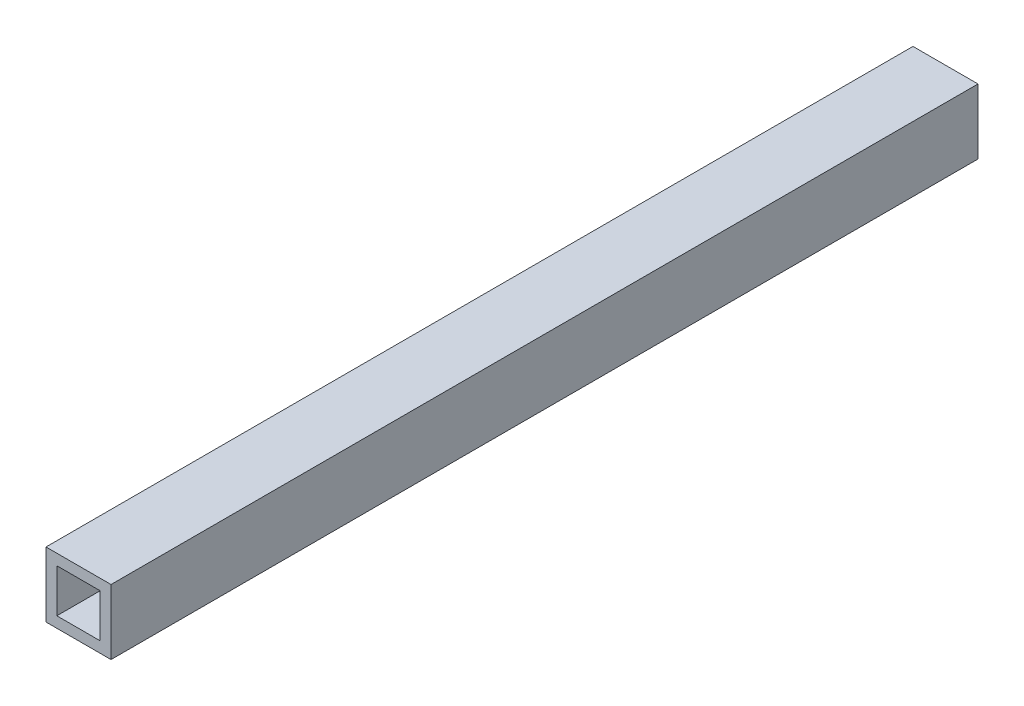
ISO-10303-21;
HEADER;
FILE_DESCRIPTION(('STEP AP214'),'2;1');
FILE_NAME('part.step','',(''),(''),'','','');
FILE_SCHEMA(('AUTOMOTIVE_DESIGN { 1 0 10303 214 1 1 1 1 }'));
ENDSEC;
DATA;
#1=APPLICATION_CONTEXT('core data for automotive mechanical design processes');
#2=APPLICATION_PROTOCOL_DEFINITION('international standard','automotive_design',2000,#1);
#3=PRODUCT_CONTEXT('',#1,'mechanical');
#4=PRODUCT('Part','Part','',(#3));
#5=PRODUCT_RELATED_PRODUCT_CATEGORY('part','',(#4));
#6=PRODUCT_DEFINITION_FORMATION('','',#4);
#7=PRODUCT_DEFINITION_CONTEXT('part definition',#1,'design');
#8=PRODUCT_DEFINITION('design','',#6,#7);
#9=PRODUCT_DEFINITION_SHAPE('','',#8);
#10=(LENGTH_UNIT() NAMED_UNIT(*) SI_UNIT(.MILLI.,.METRE.));
#11=(NAMED_UNIT(*) PLANE_ANGLE_UNIT() SI_UNIT($,.RADIAN.));
#12=(NAMED_UNIT(*) SI_UNIT($,.STERADIAN.) SOLID_ANGLE_UNIT());
#13=UNCERTAINTY_MEASURE_WITH_UNIT(LENGTH_MEASURE(1.E-05),#10,'distance_accuracy_value','');
#14=(GEOMETRIC_REPRESENTATION_CONTEXT(3) GLOBAL_UNCERTAINTY_ASSIGNED_CONTEXT((#13)) GLOBAL_UNIT_ASSIGNED_CONTEXT((#10,
#11,#12)) REPRESENTATION_CONTEXT('',''));
#15=CARTESIAN_POINT('',(0.,0.,0.));
#16=DIRECTION('',(0.,0.,1.));
#17=DIRECTION('',(1.,0.,0.));
#18=AXIS2_PLACEMENT_3D('',#15,#16,#17);
#19=CARTESIAN_POINT('',(0.,0.,400.));
#20=DIRECTION('',(0.,0.,1.));
#21=DIRECTION('',(1.,0.,0.));
#22=AXIS2_PLACEMENT_3D('',#19,#20,#21);
#23=PLANE('',#22);
#24=DIRECTION('',(0.,1.,0.));
#25=VECTOR('',#24,1.);
#26=CARTESIAN_POINT('',(15.,15.,400.));
#27=LINE('',#26,#25);
#28=CARTESIAN_POINT('',(15.,-15.,400.));
#29=VERTEX_POINT('',#28);
#30=CARTESIAN_POINT('',(15.,15.,400.));
#31=VERTEX_POINT('',#30);
#32=EDGE_CURVE('E136',#29,#31,#27,.T.);
#33=ORIENTED_EDGE('',*,*,#32,.T.);
#34=DIRECTION('',(-1.,0.,0.));
#35=VECTOR('',#34,1.);
#36=CARTESIAN_POINT('',(-15.,15.,400.));
#37=LINE('',#36,#35);
#38=CARTESIAN_POINT('',(-15.,15.,400.));
#39=VERTEX_POINT('',#38);
#40=EDGE_CURVE('E139',#31,#39,#37,.T.);
#41=ORIENTED_EDGE('',*,*,#40,.T.);
#42=DIRECTION('',(0.,-1.,0.));
#43=VECTOR('',#42,1.);
#44=CARTESIAN_POINT('',(-15.,15.,400.));
#45=LINE('',#44,#43);
#46=CARTESIAN_POINT('',(-15.,-15.,400.));
#47=VERTEX_POINT('',#46);
#48=EDGE_CURVE('E142',#39,#47,#45,.T.);
#49=ORIENTED_EDGE('',*,*,#48,.T.);
#50=DIRECTION('',(1.,0.,0.));
#51=VECTOR('',#50,1.);
#52=CARTESIAN_POINT('',(-15.,-15.,400.));
#53=LINE('',#52,#51);
#54=EDGE_CURVE('E144',#47,#29,#53,.T.);
#55=ORIENTED_EDGE('',*,*,#54,.T.);
#56=EDGE_LOOP('',(#33,#41,#49,#55));
#57=FACE_BOUND('',#56,.T.);
#58=DIRECTION('',(-1.,0.,0.));
#59=VECTOR('',#58,1.);
#60=CARTESIAN_POINT('',(-10.,10.,400.));
#61=LINE('',#60,#59);
#62=CARTESIAN_POINT('',(10.,10.,400.));
#63=VERTEX_POINT('',#62);
#64=CARTESIAN_POINT('',(-10.,10.,400.));
#65=VERTEX_POINT('',#64);
#66=EDGE_CURVE('E108',#63,#65,#61,.T.);
#67=ORIENTED_EDGE('',*,*,#66,.F.);
#68=DIRECTION('',(0.,1.,0.));
#69=VECTOR('',#68,1.);
#70=CARTESIAN_POINT('',(10.,10.,400.));
#71=LINE('',#70,#69);
#72=CARTESIAN_POINT('',(10.,-10.,400.));
#73=VERTEX_POINT('',#72);
#74=EDGE_CURVE('E100',#73,#63,#71,.T.);
#75=ORIENTED_EDGE('',*,*,#74,.F.);
#76=DIRECTION('',(1.,0.,0.));
#77=VECTOR('',#76,1.);
#78=CARTESIAN_POINT('',(-10.,-10.,400.));
#79=LINE('',#78,#77);
#80=CARTESIAN_POINT('',(-10.,-10.,400.));
#81=VERTEX_POINT('',#80);
#82=EDGE_CURVE('E122',#81,#73,#79,.T.);
#83=ORIENTED_EDGE('',*,*,#82,.F.);
#84=DIRECTION('',(0.,-1.,0.));
#85=VECTOR('',#84,1.);
#86=CARTESIAN_POINT('',(-10.,10.,400.));
#87=LINE('',#86,#85);
#88=EDGE_CURVE('E120',#65,#81,#87,.T.);
#89=ORIENTED_EDGE('',*,*,#88,.F.);
#90=EDGE_LOOP('',(#67,#75,#83,#89));
#91=FACE_BOUND('',#90,.T.);
#92=ADVANCED_FACE('F35',(#57,#91),#23,.T.);
#93=CARTESIAN_POINT('',(0.,0.,0.));
#94=DIRECTION('',(0.,0.,1.));
#95=DIRECTION('',(1.,0.,0.));
#96=AXIS2_PLACEMENT_3D('',#93,#94,#95);
#97=PLANE('',#96);
#98=DIRECTION('',(0.,1.,0.));
#99=VECTOR('',#98,1.);
#100=CARTESIAN_POINT('',(15.,15.,0.));
#101=LINE('',#100,#99);
#102=CARTESIAN_POINT('',(15.,-15.,0.));
#103=VERTEX_POINT('',#102);
#104=CARTESIAN_POINT('',(15.,15.,0.));
#105=VERTEX_POINT('',#104);
#106=EDGE_CURVE('E116',#103,#105,#101,.T.);
#107=ORIENTED_EDGE('',*,*,#106,.F.);
#108=DIRECTION('',(1.,0.,0.));
#109=VECTOR('',#108,1.);
#110=CARTESIAN_POINT('',(-15.,-15.,0.));
#111=LINE('',#110,#109);
#112=CARTESIAN_POINT('',(-15.,-15.,0.));
#113=VERTEX_POINT('',#112);
#114=EDGE_CURVE('E140',#113,#103,#111,.T.);
#115=ORIENTED_EDGE('',*,*,#114,.F.);
#116=DIRECTION('',(0.,-1.,0.));
#117=VECTOR('',#116,1.);
#118=CARTESIAN_POINT('',(-15.,15.,0.));
#119=LINE('',#118,#117);
#120=CARTESIAN_POINT('',(-15.,15.,0.));
#121=VERTEX_POINT('',#120);
#122=EDGE_CURVE('E151',#121,#113,#119,.T.);
#123=ORIENTED_EDGE('',*,*,#122,.F.);
#124=DIRECTION('',(-1.,0.,0.));
#125=VECTOR('',#124,1.);
#126=CARTESIAN_POINT('',(-15.,15.,0.));
#127=LINE('',#126,#125);
#128=EDGE_CURVE('E149',#105,#121,#127,.T.);
#129=ORIENTED_EDGE('',*,*,#128,.F.);
#130=EDGE_LOOP('',(#107,#115,#123,#129));
#131=FACE_BOUND('',#130,.T.);
#132=DIRECTION('',(0.,1.,0.));
#133=VECTOR('',#132,1.);
#134=CARTESIAN_POINT('',(10.,10.,0.));
#135=LINE('',#134,#133);
#136=CARTESIAN_POINT('',(10.,-10.,0.));
#137=VERTEX_POINT('',#136);
#138=CARTESIAN_POINT('',(10.,10.,0.));
#139=VERTEX_POINT('',#138);
#140=EDGE_CURVE('E58',#137,#139,#135,.T.);
#141=ORIENTED_EDGE('',*,*,#140,.T.);
#142=DIRECTION('',(-1.,0.,0.));
#143=VECTOR('',#142,1.);
#144=CARTESIAN_POINT('',(-10.,10.,0.));
#145=LINE('',#144,#143);
#146=CARTESIAN_POINT('',(-10.,10.,0.));
#147=VERTEX_POINT('',#146);
#148=EDGE_CURVE('E115',#139,#147,#145,.T.);
#149=ORIENTED_EDGE('',*,*,#148,.T.);
#150=DIRECTION('',(0.,-1.,0.));
#151=VECTOR('',#150,1.);
#152=CARTESIAN_POINT('',(-10.,10.,0.));
#153=LINE('',#152,#151);
#154=CARTESIAN_POINT('',(-10.,-10.,0.));
#155=VERTEX_POINT('',#154);
#156=EDGE_CURVE('E128',#147,#155,#153,.T.);
#157=ORIENTED_EDGE('',*,*,#156,.T.);
#158=DIRECTION('',(1.,0.,0.));
#159=VECTOR('',#158,1.);
#160=CARTESIAN_POINT('',(-10.,-10.,0.));
#161=LINE('',#160,#159);
#162=EDGE_CURVE('E109',#155,#137,#161,.T.);
#163=ORIENTED_EDGE('',*,*,#162,.T.);
#164=EDGE_LOOP('',(#141,#149,#157,#163));
#165=FACE_BOUND('',#164,.T.);
#166=ADVANCED_FACE('F169',(#131,#165),#97,.F.);
#167=CARTESIAN_POINT('',(15.,15.,400.));
#168=DIRECTION('',(-1.,0.,0.));
#169=DIRECTION('',(0.,0.,1.));
#170=AXIS2_PLACEMENT_3D('',#167,#168,#169);
#171=PLANE('',#170);
#172=ORIENTED_EDGE('',*,*,#106,.T.);
#173=DIRECTION('',(0.,0.,-1.));
#174=VECTOR('',#173,1.);
#175=CARTESIAN_POINT('',(15.,15.,400.));
#176=LINE('',#175,#174);
#177=EDGE_CURVE('E11',#31,#105,#176,.T.);
#178=ORIENTED_EDGE('',*,*,#177,.F.);
#179=ORIENTED_EDGE('',*,*,#32,.F.);
#180=DIRECTION('',(0.,0.,-1.));
#181=VECTOR('',#180,1.);
#182=CARTESIAN_POINT('',(15.,-15.,400.));
#183=LINE('',#182,#181);
#184=EDGE_CURVE('E146',#29,#103,#183,.T.);
#185=ORIENTED_EDGE('',*,*,#184,.T.);
#186=EDGE_LOOP('',(#172,#178,#179,#185));
#187=FACE_BOUND('',#186,.T.);
#188=ADVANCED_FACE('F37',(#187),#171,.F.);
#189=CARTESIAN_POINT('',(-15.,15.,400.));
#190=DIRECTION('',(0.,-1.,0.));
#191=DIRECTION('',(0.,0.,-1.));
#192=AXIS2_PLACEMENT_3D('',#189,#190,#191);
#193=PLANE('',#192);
#194=ORIENTED_EDGE('',*,*,#128,.T.);
#195=DIRECTION('',(0.,0.,-1.));
#196=VECTOR('',#195,1.);
#197=CARTESIAN_POINT('',(-15.,15.,400.));
#198=LINE('',#197,#196);
#199=EDGE_CURVE('E43',#39,#121,#198,.T.);
#200=ORIENTED_EDGE('',*,*,#199,.F.);
#201=ORIENTED_EDGE('',*,*,#40,.F.);
#202=ORIENTED_EDGE('',*,*,#177,.T.);
#203=EDGE_LOOP('',(#194,#200,#201,#202));
#204=FACE_BOUND('',#203,.T.);
#205=ADVANCED_FACE('F179',(#204),#193,.F.);
#206=CARTESIAN_POINT('',(-15.,15.,400.));
#207=DIRECTION('',(1.,0.,0.));
#208=DIRECTION('',(0.,0.,-1.));
#209=AXIS2_PLACEMENT_3D('',#206,#207,#208);
#210=PLANE('',#209);
#211=ORIENTED_EDGE('',*,*,#122,.T.);
#212=DIRECTION('',(0.,0.,-1.));
#213=VECTOR('',#212,1.);
#214=CARTESIAN_POINT('',(-15.,-15.,400.));
#215=LINE('',#214,#213);
#216=EDGE_CURVE('E156',#47,#113,#215,.T.);
#217=ORIENTED_EDGE('',*,*,#216,.F.);
#218=ORIENTED_EDGE('',*,*,#48,.F.);
#219=ORIENTED_EDGE('',*,*,#199,.T.);
#220=EDGE_LOOP('',(#211,#217,#218,#219));
#221=FACE_BOUND('',#220,.T.);
#222=ADVANCED_FACE('F163',(#221),#210,.F.);
#223=CARTESIAN_POINT('',(-15.,-15.,400.));
#224=DIRECTION('',(0.,1.,0.));
#225=DIRECTION('',(0.,0.,1.));
#226=AXIS2_PLACEMENT_3D('',#223,#224,#225);
#227=PLANE('',#226);
#228=ORIENTED_EDGE('',*,*,#114,.T.);
#229=ORIENTED_EDGE('',*,*,#184,.F.);
#230=ORIENTED_EDGE('',*,*,#54,.F.);
#231=ORIENTED_EDGE('',*,*,#216,.T.);
#232=EDGE_LOOP('',(#228,#229,#230,#231));
#233=FACE_BOUND('',#232,.T.);
#234=ADVANCED_FACE('F173',(#233),#227,.F.);
#235=CARTESIAN_POINT('',(10.,10.,400.));
#236=DIRECTION('',(-1.,0.,0.));
#237=DIRECTION('',(0.,0.,1.));
#238=AXIS2_PLACEMENT_3D('',#235,#236,#237);
#239=PLANE('',#238);
#240=ORIENTED_EDGE('',*,*,#140,.F.);
#241=DIRECTION('',(0.,0.,-1.));
#242=VECTOR('',#241,1.);
#243=CARTESIAN_POINT('',(10.,-10.,400.));
#244=LINE('',#243,#242);
#245=EDGE_CURVE('E104',#73,#137,#244,.T.);
#246=ORIENTED_EDGE('',*,*,#245,.F.);
#247=ORIENTED_EDGE('',*,*,#74,.T.);
#248=DIRECTION('',(0.,0.,-1.));
#249=VECTOR('',#248,1.);
#250=CARTESIAN_POINT('',(10.,10.,400.));
#251=LINE('',#250,#249);
#252=EDGE_CURVE('E103',#63,#139,#251,.T.);
#253=ORIENTED_EDGE('',*,*,#252,.T.);
#254=EDGE_LOOP('',(#240,#246,#247,#253));
#255=FACE_BOUND('',#254,.T.);
#256=ADVANCED_FACE('F102',(#255),#239,.T.);
#257=CARTESIAN_POINT('',(-10.,10.,400.));
#258=DIRECTION('',(0.,-1.,0.));
#259=DIRECTION('',(0.,0.,-1.));
#260=AXIS2_PLACEMENT_3D('',#257,#258,#259);
#261=PLANE('',#260);
#262=ORIENTED_EDGE('',*,*,#148,.F.);
#263=ORIENTED_EDGE('',*,*,#252,.F.);
#264=ORIENTED_EDGE('',*,*,#66,.T.);
#265=DIRECTION('',(0.,0.,-1.));
#266=VECTOR('',#265,1.);
#267=CARTESIAN_POINT('',(-10.,10.,400.));
#268=LINE('',#267,#266);
#269=EDGE_CURVE('E117',#65,#147,#268,.T.);
#270=ORIENTED_EDGE('',*,*,#269,.T.);
#271=EDGE_LOOP('',(#262,#263,#264,#270));
#272=FACE_BOUND('',#271,.T.);
#273=ADVANCED_FACE('F112',(#272),#261,.T.);
#274=CARTESIAN_POINT('',(-10.,10.,400.));
#275=DIRECTION('',(1.,0.,0.));
#276=DIRECTION('',(0.,0.,-1.));
#277=AXIS2_PLACEMENT_3D('',#274,#275,#276);
#278=PLANE('',#277);
#279=ORIENTED_EDGE('',*,*,#156,.F.);
#280=ORIENTED_EDGE('',*,*,#269,.F.);
#281=ORIENTED_EDGE('',*,*,#88,.T.);
#282=DIRECTION('',(0.,0.,-1.));
#283=VECTOR('',#282,1.);
#284=CARTESIAN_POINT('',(-10.,-10.,400.));
#285=LINE('',#284,#283);
#286=EDGE_CURVE('E50',#81,#155,#285,.T.);
#287=ORIENTED_EDGE('',*,*,#286,.T.);
#288=EDGE_LOOP('',(#279,#280,#281,#287));
#289=FACE_BOUND('',#288,.T.);
#290=ADVANCED_FACE('F202',(#289),#278,.T.);
#291=CARTESIAN_POINT('',(-10.,-10.,400.));
#292=DIRECTION('',(0.,1.,0.));
#293=DIRECTION('',(0.,0.,1.));
#294=AXIS2_PLACEMENT_3D('',#291,#292,#293);
#295=PLANE('',#294);
#296=ORIENTED_EDGE('',*,*,#162,.F.);
#297=ORIENTED_EDGE('',*,*,#286,.F.);
#298=ORIENTED_EDGE('',*,*,#82,.T.);
#299=ORIENTED_EDGE('',*,*,#245,.T.);
#300=EDGE_LOOP('',(#296,#297,#298,#299));
#301=FACE_BOUND('',#300,.T.);
#302=ADVANCED_FACE('F206',(#301),#295,.T.);
#303=CLOSED_SHELL('',(#92,#166,#188,#205,#222,#234,#256,#273,#290,#302));
#304=MANIFOLD_SOLID_BREP('B2',#303);
#305=ADVANCED_BREP_SHAPE_REPRESENTATION('',(#18,#304),#14);
#306=SHAPE_DEFINITION_REPRESENTATION(#9,#305);
ENDSEC;
END-ISO-10303-21;
